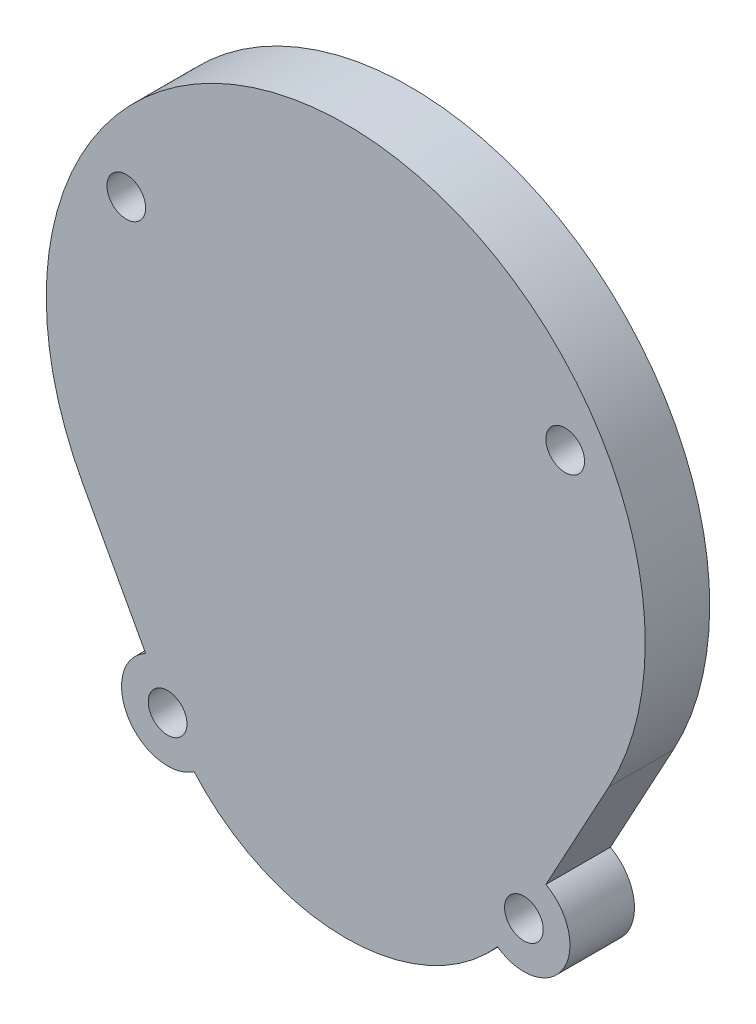
ISO-10303-21;
HEADER;
FILE_DESCRIPTION(('STEP AP214'),'2;1');
FILE_NAME('part.step','',(''),(''),'','','');
FILE_SCHEMA(('AUTOMOTIVE_DESIGN { 1 0 10303 214 1 1 1 1 }'));
ENDSEC;
DATA;
#1=APPLICATION_CONTEXT('core data for automotive mechanical design processes');
#2=APPLICATION_PROTOCOL_DEFINITION('international standard','automotive_design',2000,#1);
#3=PRODUCT_CONTEXT('',#1,'mechanical');
#4=PRODUCT('Part','Part','',(#3));
#5=PRODUCT_RELATED_PRODUCT_CATEGORY('part','',(#4));
#6=PRODUCT_DEFINITION_FORMATION('','',#4);
#7=PRODUCT_DEFINITION_CONTEXT('part definition',#1,'design');
#8=PRODUCT_DEFINITION('design','',#6,#7);
#9=PRODUCT_DEFINITION_SHAPE('','',#8);
#10=(LENGTH_UNIT() NAMED_UNIT(*) SI_UNIT(.MILLI.,.METRE.));
#11=(NAMED_UNIT(*) PLANE_ANGLE_UNIT() SI_UNIT($,.RADIAN.));
#12=(NAMED_UNIT(*) SI_UNIT($,.STERADIAN.) SOLID_ANGLE_UNIT());
#13=UNCERTAINTY_MEASURE_WITH_UNIT(LENGTH_MEASURE(1.E-05),#10,'distance_accuracy_value','');
#14=(GEOMETRIC_REPRESENTATION_CONTEXT(3) GLOBAL_UNCERTAINTY_ASSIGNED_CONTEXT((#13)) GLOBAL_UNIT_ASSIGNED_CONTEXT((#10,
#11,#12)) REPRESENTATION_CONTEXT('',''));
#15=CARTESIAN_POINT('',(0.,0.,0.));
#16=DIRECTION('',(0.,0.,1.));
#17=DIRECTION('',(1.,0.,0.));
#18=AXIS2_PLACEMENT_3D('',#15,#16,#17);
#19=CARTESIAN_POINT('',(19.3326149291812,-32.5,7.));
#20=DIRECTION('',(0.,0.,1.));
#21=DIRECTION('',(1.,0.,0.));
#22=AXIS2_PLACEMENT_3D('',#19,#20,#21);
#23=PLANE('',#22);
#24=CARTESIAN_POINT('',(23.815698604072,13.7500000000001,7.));
#25=DIRECTION('',(0.,0.,1.));
#26=DIRECTION('',(1.,0.,0.));
#27=AXIS2_PLACEMENT_3D('',#24,#25,#26);
#28=CIRCLE('',#27,2.1);
#29=CARTESIAN_POINT('',(25.915698604072,13.7500000000001,7.));
#30=VERTEX_POINT('',#29);
#31=EDGE_CURVE('E264',#30,#30,#28,.T.);
#32=ORIENTED_EDGE('',*,*,#31,.F.);
#33=EDGE_LOOP('',(#32));
#34=FACE_BOUND('',#33,.T.);
#35=CARTESIAN_POINT('',(-19.3326149291812,-32.5,7.));
#36=DIRECTION('',(0.,0.,1.));
#37=DIRECTION('',(1.,0.,0.));
#38=AXIS2_PLACEMENT_3D('',#35,#36,#37);
#39=CIRCLE('',#38,2.1);
#40=CARTESIAN_POINT('',(-17.2326149291812,-32.5,7.));
#41=VERTEX_POINT('',#40);
#42=EDGE_CURVE('E274',#41,#41,#39,.T.);
#43=ORIENTED_EDGE('',*,*,#42,.F.);
#44=EDGE_LOOP('',(#43));
#45=FACE_BOUND('',#44,.T.);
#46=CARTESIAN_POINT('',(19.3326149291812,-32.5,7.));
#47=DIRECTION('',(0.,0.,1.));
#48=DIRECTION('',(1.,0.,0.));
#49=AXIS2_PLACEMENT_3D('',#46,#47,#48);
#50=CIRCLE('',#49,5.);
#51=CARTESIAN_POINT('',(16.4624164398827,-36.5941373489453,7.));
#52=VERTEX_POINT('',#51);
#53=CARTESIAN_POINT('',(21.7189785655448,-28.1062238797315,7.));
#54=VERTEX_POINT('',#53);
#55=EDGE_CURVE('E280',#52,#54,#50,.T.);
#56=ORIENTED_EDGE('',*,*,#55,.T.);
#57=DIRECTION('',(0.477272727272727,0.878755224053691,0.));
#58=VECTOR('',#57,1.);
#59=CARTESIAN_POINT('',(28.559544781745,-15.5113636363636,7.));
#60=LINE('',#59,#58);
#61=CARTESIAN_POINT('',(28.559544781745,-15.5113636363636,7.));
#62=VERTEX_POINT('',#61);
#63=EDGE_CURVE('E283',#54,#62,#60,.T.);
#64=ORIENTED_EDGE('',*,*,#63,.T.);
#65=CARTESIAN_POINT('',(0.,0.,7.));
#66=DIRECTION('',(0.,0.,1.));
#67=DIRECTION('',(1.,0.,0.));
#68=AXIS2_PLACEMENT_3D('',#65,#66,#67);
#69=CIRCLE('',#68,32.5);
#70=CARTESIAN_POINT('',(-28.559544781745,-15.5113636363636,7.));
#71=VERTEX_POINT('',#70);
#72=EDGE_CURVE('E286',#62,#71,#69,.T.);
#73=ORIENTED_EDGE('',*,*,#72,.T.);
#74=DIRECTION('',(0.477272727272728,-0.878755224053691,0.));
#75=VECTOR('',#74,1.);
#76=CARTESIAN_POINT('',(-28.559544781745,-15.5113636363636,7.));
#77=LINE('',#76,#75);
#78=CARTESIAN_POINT('',(-21.7189785655448,-28.1062238797315,7.));
#79=VERTEX_POINT('',#78);
#80=EDGE_CURVE('E288',#71,#79,#77,.T.);
#81=ORIENTED_EDGE('',*,*,#80,.T.);
#82=CARTESIAN_POINT('',(-19.3326149291812,-32.5,7.));
#83=DIRECTION('',(0.,0.,1.));
#84=DIRECTION('',(1.,0.,0.));
#85=AXIS2_PLACEMENT_3D('',#82,#83,#84);
#86=CIRCLE('',#85,5.);
#87=CARTESIAN_POINT('',(-16.4624164398827,-36.5941373489453,7.));
#88=VERTEX_POINT('',#87);
#89=EDGE_CURVE('E290',#79,#88,#86,.T.);
#90=ORIENTED_EDGE('',*,*,#89,.T.);
#91=CARTESIAN_POINT('',(0.,-22.,7.));
#92=DIRECTION('',(0.,0.,1.));
#93=DIRECTION('',(1.,0.,0.));
#94=AXIS2_PLACEMENT_3D('',#91,#92,#93);
#95=CIRCLE('',#94,22.);
#96=EDGE_CURVE('E292',#88,#52,#95,.T.);
#97=ORIENTED_EDGE('',*,*,#96,.T.);
#98=EDGE_LOOP('',(#56,#64,#73,#81,#90,#97));
#99=FACE_BOUND('',#98,.T.);
#100=CARTESIAN_POINT('',(-23.8156986040721,13.7499999999999,7.));
#101=DIRECTION('',(0.,0.,1.));
#102=DIRECTION('',(1.,0.,0.));
#103=AXIS2_PLACEMENT_3D('',#100,#101,#102);
#104=CIRCLE('',#103,2.1);
#105=CARTESIAN_POINT('',(-21.7156986040721,13.7499999999999,7.));
#106=VERTEX_POINT('',#105);
#107=EDGE_CURVE('E269',#106,#106,#104,.T.);
#108=ORIENTED_EDGE('',*,*,#107,.F.);
#109=EDGE_LOOP('',(#108));
#110=FACE_BOUND('',#109,.T.);
#111=CARTESIAN_POINT('',(19.3326149291812,-32.5,7.));
#112=DIRECTION('',(0.,0.,1.));
#113=DIRECTION('',(1.,0.,0.));
#114=AXIS2_PLACEMENT_3D('',#111,#112,#113);
#115=CIRCLE('',#114,2.1);
#116=CARTESIAN_POINT('',(21.4326149291812,-32.5,7.));
#117=VERTEX_POINT('',#116);
#118=EDGE_CURVE('E258',#117,#117,#115,.T.);
#119=ORIENTED_EDGE('',*,*,#118,.F.);
#120=EDGE_LOOP('',(#119));
#121=FACE_BOUND('',#120,.T.);
#122=ADVANCED_FACE('F35',(#34,#45,#99,#110,#121),#23,.T.);
#123=CARTESIAN_POINT('',(19.3326149291812,-32.5,0.));
#124=DIRECTION('',(0.,0.,1.));
#125=DIRECTION('',(1.,0.,0.));
#126=AXIS2_PLACEMENT_3D('',#123,#124,#125);
#127=PLANE('',#126);
#128=CARTESIAN_POINT('',(0.,0.,0.));
#129=DIRECTION('',(0.,0.,-1.));
#130=DIRECTION('',(-1.,0.,0.));
#131=AXIS2_PLACEMENT_3D('',#128,#129,#130);
#132=CIRCLE('',#131,27.);
#133=CARTESIAN_POINT('',(-23.7263910494496,-12.8863636363637,0.));
#134=VERTEX_POINT('',#133);
#135=CARTESIAN_POINT('',(-24.3269653882902,11.7131872262391,0.));
#136=VERTEX_POINT('',#135);
#137=EDGE_CURVE('E58',#134,#136,#132,.T.);
#138=ORIENTED_EDGE('',*,*,#137,.F.);
#139=DIRECTION('',(-0.477272727272728,0.878755224053691,0.));
#140=VECTOR('',#139,1.);
#141=CARTESIAN_POINT('',(-23.7263910494497,-12.8863636363636,0.));
#142=LINE('',#141,#140);
#143=CARTESIAN_POINT('',(-14.4994611968859,-29.875,0.));
#144=VERTEX_POINT('',#143);
#145=EDGE_CURVE('E227',#144,#134,#142,.T.);
#146=ORIENTED_EDGE('',*,*,#145,.F.);
#147=CARTESIAN_POINT('',(0.,-22.,0.));
#148=DIRECTION('',(0.,0.,-1.));
#149=DIRECTION('',(-1.,0.,0.));
#150=AXIS2_PLACEMENT_3D('',#147,#148,#149);
#151=CIRCLE('',#150,16.5);
#152=CARTESIAN_POINT('',(14.4994611968859,-29.875,0.));
#153=VERTEX_POINT('',#152);
#154=EDGE_CURVE('E224',#153,#144,#151,.T.);
#155=ORIENTED_EDGE('',*,*,#154,.F.);
#156=DIRECTION('',(-0.477272727272727,-0.878755224053691,0.));
#157=VECTOR('',#156,1.);
#158=CARTESIAN_POINT('',(23.7263910494497,-12.8863636363636,0.));
#159=LINE('',#158,#157);
#160=CARTESIAN_POINT('',(23.7263910494497,-12.8863636363636,0.));
#161=VERTEX_POINT('',#160);
#162=EDGE_CURVE('E221',#161,#153,#159,.T.);
#163=ORIENTED_EDGE('',*,*,#162,.F.);
#164=CARTESIAN_POINT('',(0.,0.,0.));
#165=DIRECTION('',(0.,0.,-1.));
#166=DIRECTION('',(-1.,0.,0.));
#167=AXIS2_PLACEMENT_3D('',#164,#165,#166);
#168=CIRCLE('',#167,27.);
#169=CARTESIAN_POINT('',(24.3269653882901,11.7131872262393,0.));
#170=VERTEX_POINT('',#169);
#171=EDGE_CURVE('E218',#170,#161,#168,.T.);
#172=ORIENTED_EDGE('',*,*,#171,.F.);
#173=CARTESIAN_POINT('',(23.815698604072,13.7500000000001,0.));
#174=DIRECTION('',(0.,0.,1.));
#175=DIRECTION('',(1.,0.,0.));
#176=AXIS2_PLACEMENT_3D('',#173,#174,#175);
#177=CIRCLE('',#176,2.1);
#178=CARTESIAN_POINT('',(22.3074003913515,15.2111764101246,0.));
#179=VERTEX_POINT('',#178);
#180=EDGE_CURVE('E261',#170,#179,#177,.T.);
#181=ORIENTED_EDGE('',*,*,#180,.T.);
#182=CARTESIAN_POINT('',(0.,0.,0.));
#183=DIRECTION('',(0.,0.,-1.));
#184=DIRECTION('',(-1.,0.,0.));
#185=AXIS2_PLACEMENT_3D('',#182,#183,#184);
#186=CIRCLE('',#185,27.);
#187=CARTESIAN_POINT('',(-22.3074003913516,15.2111764101244,0.));
#188=VERTEX_POINT('',#187);
#189=EDGE_CURVE('E215',#188,#179,#186,.T.);
#190=ORIENTED_EDGE('',*,*,#189,.F.);
#191=CARTESIAN_POINT('',(-23.8156986040721,13.7499999999999,0.));
#192=DIRECTION('',(0.,0.,1.));
#193=DIRECTION('',(1.,0.,0.));
#194=AXIS2_PLACEMENT_3D('',#191,#192,#193);
#195=CIRCLE('',#194,2.1);
#196=EDGE_CURVE('E267',#188,#136,#195,.T.);
#197=ORIENTED_EDGE('',*,*,#196,.T.);
#198=EDGE_LOOP('',(#138,#146,#155,#163,#172,#181,#190,#197));
#199=FACE_BOUND('',#198,.T.);
#200=CARTESIAN_POINT('',(19.3326149291812,-32.5,0.));
#201=DIRECTION('',(0.,0.,1.));
#202=DIRECTION('',(1.,0.,0.));
#203=AXIS2_PLACEMENT_3D('',#200,#201,#202);
#204=CIRCLE('',#203,5.);
#205=CARTESIAN_POINT('',(16.4624164398827,-36.5941373489453,0.));
#206=VERTEX_POINT('',#205);
#207=CARTESIAN_POINT('',(21.7189785655448,-28.1062238797315,0.));
#208=VERTEX_POINT('',#207);
#209=EDGE_CURVE('E277',#206,#208,#204,.T.);
#210=ORIENTED_EDGE('',*,*,#209,.F.);
#211=CARTESIAN_POINT('',(0.,-22.,0.));
#212=DIRECTION('',(0.,0.,1.));
#213=DIRECTION('',(1.,0.,0.));
#214=AXIS2_PLACEMENT_3D('',#211,#212,#213);
#215=CIRCLE('',#214,22.);
#216=CARTESIAN_POINT('',(-16.4624164398827,-36.5941373489453,0.));
#217=VERTEX_POINT('',#216);
#218=EDGE_CURVE('E284',#217,#206,#215,.T.);
#219=ORIENTED_EDGE('',*,*,#218,.F.);
#220=CARTESIAN_POINT('',(-19.3326149291812,-32.5,0.));
#221=DIRECTION('',(0.,0.,1.));
#222=DIRECTION('',(1.,0.,0.));
#223=AXIS2_PLACEMENT_3D('',#220,#221,#222);
#224=CIRCLE('',#223,5.);
#225=CARTESIAN_POINT('',(-21.7189785655448,-28.1062238797315,0.));
#226=VERTEX_POINT('',#225);
#227=EDGE_CURVE('E303',#226,#217,#224,.T.);
#228=ORIENTED_EDGE('',*,*,#227,.F.);
#229=DIRECTION('',(0.477272727272728,-0.878755224053691,0.));
#230=VECTOR('',#229,1.);
#231=CARTESIAN_POINT('',(-28.559544781745,-15.5113636363636,0.));
#232=LINE('',#231,#230);
#233=CARTESIAN_POINT('',(-28.559544781745,-15.5113636363636,0.));
#234=VERTEX_POINT('',#233);
#235=EDGE_CURVE('E301',#234,#226,#232,.T.);
#236=ORIENTED_EDGE('',*,*,#235,.F.);
#237=CARTESIAN_POINT('',(0.,0.,0.));
#238=DIRECTION('',(0.,0.,1.));
#239=DIRECTION('',(1.,0.,0.));
#240=AXIS2_PLACEMENT_3D('',#237,#238,#239);
#241=CIRCLE('',#240,32.5);
#242=CARTESIAN_POINT('',(28.559544781745,-15.5113636363636,0.));
#243=VERTEX_POINT('',#242);
#244=EDGE_CURVE('E299',#243,#234,#241,.T.);
#245=ORIENTED_EDGE('',*,*,#244,.F.);
#246=DIRECTION('',(0.477272727272727,0.878755224053691,0.));
#247=VECTOR('',#246,1.);
#248=CARTESIAN_POINT('',(28.559544781745,-15.5113636363636,0.));
#249=LINE('',#248,#247);
#250=EDGE_CURVE('E297',#208,#243,#249,.T.);
#251=ORIENTED_EDGE('',*,*,#250,.F.);
#252=EDGE_LOOP('',(#210,#219,#228,#236,#245,#251));
#253=FACE_BOUND('',#252,.T.);
#254=CARTESIAN_POINT('',(-19.3326149291812,-32.5,0.));
#255=DIRECTION('',(0.,0.,1.));
#256=DIRECTION('',(1.,0.,0.));
#257=AXIS2_PLACEMENT_3D('',#254,#255,#256);
#258=CIRCLE('',#257,2.1);
#259=CARTESIAN_POINT('',(-17.2326149291812,-32.5,0.));
#260=VERTEX_POINT('',#259);
#261=EDGE_CURVE('E272',#260,#260,#258,.T.);
#262=ORIENTED_EDGE('',*,*,#261,.T.);
#263=EDGE_LOOP('',(#262));
#264=FACE_BOUND('',#263,.T.);
#265=CARTESIAN_POINT('',(19.3326149291812,-32.5,0.));
#266=DIRECTION('',(0.,0.,1.));
#267=DIRECTION('',(1.,0.,0.));
#268=AXIS2_PLACEMENT_3D('',#265,#266,#267);
#269=CIRCLE('',#268,2.1);
#270=CARTESIAN_POINT('',(21.4326149291812,-32.5,0.));
#271=VERTEX_POINT('',#270);
#272=EDGE_CURVE('E253',#271,#271,#269,.T.);
#273=ORIENTED_EDGE('',*,*,#272,.T.);
#274=EDGE_LOOP('',(#273));
#275=FACE_BOUND('',#274,.T.);
#276=ADVANCED_FACE('F327',(#199,#253,#264,#275),#127,.F.);
#277=CARTESIAN_POINT('',(19.3326149291812,-32.5,7.));
#278=DIRECTION('',(0.,0.,-1.));
#279=DIRECTION('',(-1.,0.,0.));
#280=AXIS2_PLACEMENT_3D('',#277,#278,#279);
#281=CYLINDRICAL_SURFACE('',#280,5.);
#282=ORIENTED_EDGE('',*,*,#209,.T.);
#283=DIRECTION('',(0.,0.,-1.));
#284=VECTOR('',#283,1.);
#285=CARTESIAN_POINT('',(21.7189785655448,-28.1062238797315,7.));
#286=LINE('',#285,#284);
#287=EDGE_CURVE('E11',#54,#208,#286,.T.);
#288=ORIENTED_EDGE('',*,*,#287,.F.);
#289=ORIENTED_EDGE('',*,*,#55,.F.);
#290=DIRECTION('',(0.,0.,-1.));
#291=VECTOR('',#290,1.);
#292=CARTESIAN_POINT('',(16.4624164398827,-36.5941373489453,7.));
#293=LINE('',#292,#291);
#294=EDGE_CURVE('E294',#52,#206,#293,.T.);
#295=ORIENTED_EDGE('',*,*,#294,.T.);
#296=EDGE_LOOP('',(#282,#288,#289,#295));
#297=FACE_BOUND('',#296,.T.);
#298=ADVANCED_FACE('F37',(#297),#281,.T.);
#299=CARTESIAN_POINT('',(28.559544781745,-15.5113636363636,7.));
#300=DIRECTION('',(-0.878755224053691,0.477272727272727,0.));
#301=DIRECTION('',(-0.477272727272727,-0.878755224053691,0.));
#302=AXIS2_PLACEMENT_3D('',#299,#300,#301);
#303=PLANE('',#302);
#304=ORIENTED_EDGE('',*,*,#250,.T.);
#305=DIRECTION('',(0.,0.,-1.));
#306=VECTOR('',#305,1.);
#307=CARTESIAN_POINT('',(28.559544781745,-15.5113636363636,7.));
#308=LINE('',#307,#306);
#309=EDGE_CURVE('E43',#62,#243,#308,.T.);
#310=ORIENTED_EDGE('',*,*,#309,.F.);
#311=ORIENTED_EDGE('',*,*,#63,.F.);
#312=ORIENTED_EDGE('',*,*,#287,.T.);
#313=EDGE_LOOP('',(#304,#310,#311,#312));
#314=FACE_BOUND('',#313,.T.);
#315=ADVANCED_FACE('F345',(#314),#303,.F.);
#316=CARTESIAN_POINT('',(0.,0.,7.));
#317=DIRECTION('',(0.,0.,-1.));
#318=DIRECTION('',(-1.,0.,0.));
#319=AXIS2_PLACEMENT_3D('',#316,#317,#318);
#320=CYLINDRICAL_SURFACE('',#319,32.5);
#321=ORIENTED_EDGE('',*,*,#244,.T.);
#322=DIRECTION('',(0.,0.,-1.));
#323=VECTOR('',#322,1.);
#324=CARTESIAN_POINT('',(-28.559544781745,-15.5113636363636,7.));
#325=LINE('',#324,#323);
#326=EDGE_CURVE('E314',#71,#234,#325,.T.);
#327=ORIENTED_EDGE('',*,*,#326,.F.);
#328=ORIENTED_EDGE('',*,*,#72,.F.);
#329=ORIENTED_EDGE('',*,*,#309,.T.);
#330=EDGE_LOOP('',(#321,#327,#328,#329));
#331=FACE_BOUND('',#330,.T.);
#332=ADVANCED_FACE('F321',(#331),#320,.T.);
#333=CARTESIAN_POINT('',(-28.559544781745,-15.5113636363636,7.));
#334=DIRECTION('',(0.878755224053691,0.477272727272728,0.));
#335=DIRECTION('',(-0.477272727272728,0.878755224053691,0.));
#336=AXIS2_PLACEMENT_3D('',#333,#334,#335);
#337=PLANE('',#336);
#338=ORIENTED_EDGE('',*,*,#235,.T.);
#339=DIRECTION('',(0.,0.,-1.));
#340=VECTOR('',#339,1.);
#341=CARTESIAN_POINT('',(-21.7189785655448,-28.1062238797315,7.));
#342=LINE('',#341,#340);
#343=EDGE_CURVE('E311',#79,#226,#342,.T.);
#344=ORIENTED_EDGE('',*,*,#343,.F.);
#345=ORIENTED_EDGE('',*,*,#80,.F.);
#346=ORIENTED_EDGE('',*,*,#326,.T.);
#347=EDGE_LOOP('',(#338,#344,#345,#346));
#348=FACE_BOUND('',#347,.T.);
#349=ADVANCED_FACE('F333',(#348),#337,.F.);
#350=CARTESIAN_POINT('',(-19.3326149291812,-32.5,7.));
#351=DIRECTION('',(0.,0.,-1.));
#352=DIRECTION('',(-1.,0.,0.));
#353=AXIS2_PLACEMENT_3D('',#350,#351,#352);
#354=CYLINDRICAL_SURFACE('',#353,5.);
#355=ORIENTED_EDGE('',*,*,#227,.T.);
#356=DIRECTION('',(0.,0.,-1.));
#357=VECTOR('',#356,1.);
#358=CARTESIAN_POINT('',(-16.4624164398827,-36.5941373489453,7.));
#359=LINE('',#358,#357);
#360=EDGE_CURVE('E308',#88,#217,#359,.T.);
#361=ORIENTED_EDGE('',*,*,#360,.F.);
#362=ORIENTED_EDGE('',*,*,#89,.F.);
#363=ORIENTED_EDGE('',*,*,#343,.T.);
#364=EDGE_LOOP('',(#355,#361,#362,#363));
#365=FACE_BOUND('',#364,.T.);
#366=ADVANCED_FACE('F337',(#365),#354,.T.);
#367=CARTESIAN_POINT('',(0.,-22.,7.));
#368=DIRECTION('',(0.,0.,-1.));
#369=DIRECTION('',(-1.,0.,0.));
#370=AXIS2_PLACEMENT_3D('',#367,#368,#369);
#371=CYLINDRICAL_SURFACE('',#370,22.);
#372=ORIENTED_EDGE('',*,*,#218,.T.);
#373=ORIENTED_EDGE('',*,*,#294,.F.);
#374=ORIENTED_EDGE('',*,*,#96,.F.);
#375=ORIENTED_EDGE('',*,*,#360,.T.);
#376=EDGE_LOOP('',(#372,#373,#374,#375));
#377=FACE_BOUND('',#376,.T.);
#378=ADVANCED_FACE('F348',(#377),#371,.T.);
#379=CARTESIAN_POINT('',(-19.3326149291812,-32.5,7.));
#380=DIRECTION('',(0.,0.,-1.));
#381=DIRECTION('',(-1.,0.,0.));
#382=AXIS2_PLACEMENT_3D('',#379,#380,#381);
#383=CYLINDRICAL_SURFACE('',#382,2.1);
#384=ORIENTED_EDGE('',*,*,#42,.T.);
#385=EDGE_LOOP('',(#384));
#386=FACE_BOUND('',#385,.T.);
#387=ORIENTED_EDGE('',*,*,#261,.F.);
#388=EDGE_LOOP('',(#387));
#389=FACE_BOUND('',#388,.T.);
#390=ADVANCED_FACE('F350',(#386,#389),#383,.F.);
#391=CARTESIAN_POINT('',(-23.8156986040721,13.7499999999999,7.));
#392=DIRECTION('',(0.,0.,-1.));
#393=DIRECTION('',(-1.,0.,0.));
#394=AXIS2_PLACEMENT_3D('',#391,#392,#393);
#395=CYLINDRICAL_SURFACE('',#394,2.1);
#396=ORIENTED_EDGE('',*,*,#107,.T.);
#397=EDGE_LOOP('',(#396));
#398=FACE_BOUND('',#397,.T.);
#399=ORIENTED_EDGE('',*,*,#196,.F.);
#400=DIRECTION('',(0.,0.,1.));
#401=VECTOR('',#400,1.);
#402=CARTESIAN_POINT('',(-22.3074003913516,15.2111764101244,-2.));
#403=LINE('',#402,#401);
#404=CARTESIAN_POINT('',(-22.3074003913516,15.2111764101244,-2.));
#405=VERTEX_POINT('',#404);
#406=EDGE_CURVE('E250',#405,#188,#403,.T.);
#407=ORIENTED_EDGE('',*,*,#406,.F.);
#408=CARTESIAN_POINT('',(-23.8156986040721,13.7499999999999,-2.));
#409=DIRECTION('',(0.,0.,-1.));
#410=DIRECTION('',(-1.,0.,0.));
#411=AXIS2_PLACEMENT_3D('',#408,#409,#410);
#412=CIRCLE('',#411,2.1);
#413=CARTESIAN_POINT('',(-24.3269653882902,11.7131872262391,-2.));
#414=VERTEX_POINT('',#413);
#415=EDGE_CURVE('E187',#414,#405,#412,.F.);
#416=ORIENTED_EDGE('',*,*,#415,.F.);
#417=DIRECTION('',(0.,0.,1.));
#418=VECTOR('',#417,1.);
#419=CARTESIAN_POINT('',(-24.3269653882902,11.7131872262391,-2.));
#420=LINE('',#419,#418);
#421=EDGE_CURVE('E167',#414,#136,#420,.T.);
#422=ORIENTED_EDGE('',*,*,#421,.T.);
#423=EDGE_LOOP('',(#399,#407,#416,#422));
#424=FACE_BOUND('',#423,.T.);
#425=ADVANCED_FACE('F356',(#398,#424),#395,.F.);
#426=CARTESIAN_POINT('',(23.815698604072,13.7500000000001,7.));
#427=DIRECTION('',(0.,0.,-1.));
#428=DIRECTION('',(-1.,0.,0.));
#429=AXIS2_PLACEMENT_3D('',#426,#427,#428);
#430=CYLINDRICAL_SURFACE('',#429,2.1);
#431=ORIENTED_EDGE('',*,*,#31,.T.);
#432=EDGE_LOOP('',(#431));
#433=FACE_BOUND('',#432,.T.);
#434=ORIENTED_EDGE('',*,*,#180,.F.);
#435=DIRECTION('',(0.,0.,1.));
#436=VECTOR('',#435,1.);
#437=CARTESIAN_POINT('',(24.3269653882901,11.7131872262393,-2.));
#438=LINE('',#437,#436);
#439=CARTESIAN_POINT('',(24.3269653882901,11.7131872262393,-2.));
#440=VERTEX_POINT('',#439);
#441=EDGE_CURVE('E244',#440,#170,#438,.T.);
#442=ORIENTED_EDGE('',*,*,#441,.F.);
#443=CARTESIAN_POINT('',(23.815698604072,13.7500000000001,-2.));
#444=DIRECTION('',(0.,0.,-1.));
#445=DIRECTION('',(-1.,0.,0.));
#446=AXIS2_PLACEMENT_3D('',#443,#444,#445);
#447=CIRCLE('',#446,2.1);
#448=CARTESIAN_POINT('',(22.3074003913515,15.2111764101246,-2.));
#449=VERTEX_POINT('',#448);
#450=EDGE_CURVE('E192',#449,#440,#447,.F.);
#451=ORIENTED_EDGE('',*,*,#450,.F.);
#452=DIRECTION('',(0.,0.,1.));
#453=VECTOR('',#452,1.);
#454=CARTESIAN_POINT('',(22.3074003913515,15.2111764101246,-2.));
#455=LINE('',#454,#453);
#456=EDGE_CURVE('E247',#449,#179,#455,.T.);
#457=ORIENTED_EDGE('',*,*,#456,.T.);
#458=EDGE_LOOP('',(#434,#442,#451,#457));
#459=FACE_BOUND('',#458,.T.);
#460=ADVANCED_FACE('F373',(#433,#459),#430,.F.);
#461=CARTESIAN_POINT('',(19.3326149291812,-32.5,7.));
#462=DIRECTION('',(0.,0.,-1.));
#463=DIRECTION('',(-1.,0.,0.));
#464=AXIS2_PLACEMENT_3D('',#461,#462,#463);
#465=CYLINDRICAL_SURFACE('',#464,2.1);
#466=ORIENTED_EDGE('',*,*,#118,.T.);
#467=EDGE_LOOP('',(#466));
#468=FACE_BOUND('',#467,.T.);
#469=ORIENTED_EDGE('',*,*,#272,.F.);
#470=EDGE_LOOP('',(#469));
#471=FACE_BOUND('',#470,.T.);
#472=ADVANCED_FACE('F377',(#468,#471),#465,.F.);
#473=CARTESIAN_POINT('',(0.,0.,-2.));
#474=DIRECTION('',(0.,0.,1.));
#475=DIRECTION('',(1.,0.,0.));
#476=AXIS2_PLACEMENT_3D('',#473,#474,#475);
#477=CYLINDRICAL_SURFACE('',#476,27.);
#478=ORIENTED_EDGE('',*,*,#189,.T.);
#479=ORIENTED_EDGE('',*,*,#456,.F.);
#480=CARTESIAN_POINT('',(0.,0.,-2.));
#481=DIRECTION('',(0.,0.,-1.));
#482=DIRECTION('',(-1.,0.,0.));
#483=AXIS2_PLACEMENT_3D('',#480,#481,#482);
#484=CIRCLE('',#483,27.);
#485=EDGE_CURVE('E190',#405,#449,#484,.T.);
#486=ORIENTED_EDGE('',*,*,#485,.F.);
#487=ORIENTED_EDGE('',*,*,#406,.T.);
#488=EDGE_LOOP('',(#478,#479,#486,#487));
#489=FACE_BOUND('',#488,.T.);
#490=ADVANCED_FACE('F381',(#489),#477,.T.);
#491=CARTESIAN_POINT('',(0.,0.,-2.));
#492=DIRECTION('',(0.,0.,1.));
#493=DIRECTION('',(1.,0.,0.));
#494=AXIS2_PLACEMENT_3D('',#491,#492,#493);
#495=CYLINDRICAL_SURFACE('',#494,27.);
#496=ORIENTED_EDGE('',*,*,#171,.T.);
#497=DIRECTION('',(0.,0.,1.));
#498=VECTOR('',#497,1.);
#499=CARTESIAN_POINT('',(23.7263910494497,-12.8863636363636,-2.));
#500=LINE('',#499,#498);
#501=CARTESIAN_POINT('',(23.7263910494497,-12.8863636363636,-2.));
#502=VERTEX_POINT('',#501);
#503=EDGE_CURVE('E241',#502,#161,#500,.T.);
#504=ORIENTED_EDGE('',*,*,#503,.F.);
#505=CARTESIAN_POINT('',(0.,0.,-2.));
#506=DIRECTION('',(0.,0.,-1.));
#507=DIRECTION('',(-1.,0.,0.));
#508=AXIS2_PLACEMENT_3D('',#505,#506,#507);
#509=CIRCLE('',#508,27.);
#510=EDGE_CURVE('E194',#440,#502,#509,.T.);
#511=ORIENTED_EDGE('',*,*,#510,.F.);
#512=ORIENTED_EDGE('',*,*,#441,.T.);
#513=EDGE_LOOP('',(#496,#504,#511,#512));
#514=FACE_BOUND('',#513,.T.);
#515=ADVANCED_FACE('F399',(#514),#495,.T.);
#516=CARTESIAN_POINT('',(23.7263910494497,-12.8863636363636,-2.));
#517=DIRECTION('',(-0.878755224053691,0.477272727272727,0.));
#518=DIRECTION('',(-0.477272727272727,-0.878755224053691,0.));
#519=AXIS2_PLACEMENT_3D('',#516,#517,#518);
#520=PLANE('',#519);
#521=ORIENTED_EDGE('',*,*,#162,.T.);
#522=DIRECTION('',(0.,0.,1.));
#523=VECTOR('',#522,1.);
#524=CARTESIAN_POINT('',(14.4994611968859,-29.875,-2.));
#525=LINE('',#524,#523);
#526=CARTESIAN_POINT('',(14.4994611968859,-29.875,-2.));
#527=VERTEX_POINT('',#526);
#528=EDGE_CURVE('E238',#527,#153,#525,.T.);
#529=ORIENTED_EDGE('',*,*,#528,.F.);
#530=DIRECTION('',(-0.477272727272727,-0.878755224053691,0.));
#531=VECTOR('',#530,1.);
#532=CARTESIAN_POINT('',(23.7263910494497,-12.8863636363636,-2.));
#533=LINE('',#532,#531);
#534=EDGE_CURVE('E196',#502,#527,#533,.T.);
#535=ORIENTED_EDGE('',*,*,#534,.F.);
#536=ORIENTED_EDGE('',*,*,#503,.T.);
#537=EDGE_LOOP('',(#521,#529,#535,#536));
#538=FACE_BOUND('',#537,.T.);
#539=ADVANCED_FACE('F403',(#538),#520,.F.);
#540=CARTESIAN_POINT('',(0.,-22.,-2.));
#541=DIRECTION('',(0.,0.,1.));
#542=DIRECTION('',(1.,0.,0.));
#543=AXIS2_PLACEMENT_3D('',#540,#541,#542);
#544=CYLINDRICAL_SURFACE('',#543,16.5);
#545=ORIENTED_EDGE('',*,*,#154,.T.);
#546=DIRECTION('',(0.,0.,1.));
#547=VECTOR('',#546,1.);
#548=CARTESIAN_POINT('',(-14.4994611968859,-29.875,-2.));
#549=LINE('',#548,#547);
#550=CARTESIAN_POINT('',(-14.4994611968859,-29.875,-2.));
#551=VERTEX_POINT('',#550);
#552=EDGE_CURVE('E235',#551,#144,#549,.T.);
#553=ORIENTED_EDGE('',*,*,#552,.F.);
#554=CARTESIAN_POINT('',(0.,-22.,-2.));
#555=DIRECTION('',(0.,0.,-1.));
#556=DIRECTION('',(-1.,0.,0.));
#557=AXIS2_PLACEMENT_3D('',#554,#555,#556);
#558=CIRCLE('',#557,16.5);
#559=EDGE_CURVE('E198',#527,#551,#558,.T.);
#560=ORIENTED_EDGE('',*,*,#559,.F.);
#561=ORIENTED_EDGE('',*,*,#528,.T.);
#562=EDGE_LOOP('',(#545,#553,#560,#561));
#563=FACE_BOUND('',#562,.T.);
#564=ADVANCED_FACE('F407',(#563),#544,.T.);
#565=CARTESIAN_POINT('',(-23.7263910494497,-12.8863636363636,-2.));
#566=DIRECTION('',(0.878755224053691,0.477272727272728,0.));
#567=DIRECTION('',(-0.477272727272728,0.878755224053691,0.));
#568=AXIS2_PLACEMENT_3D('',#565,#566,#567);
#569=PLANE('',#568);
#570=ORIENTED_EDGE('',*,*,#145,.T.);
#571=DIRECTION('',(0.,0.,1.));
#572=VECTOR('',#571,1.);
#573=CARTESIAN_POINT('',(-23.7263910494496,-12.8863636363637,-2.));
#574=LINE('',#573,#572);
#575=CARTESIAN_POINT('',(-23.7263910494496,-12.8863636363637,-2.));
#576=VERTEX_POINT('',#575);
#577=EDGE_CURVE('E232',#576,#134,#574,.T.);
#578=ORIENTED_EDGE('',*,*,#577,.F.);
#579=DIRECTION('',(-0.477272727272728,0.878755224053691,0.));
#580=VECTOR('',#579,1.);
#581=CARTESIAN_POINT('',(-23.7263910494497,-12.8863636363636,-2.));
#582=LINE('',#581,#580);
#583=EDGE_CURVE('E200',#551,#576,#582,.T.);
#584=ORIENTED_EDGE('',*,*,#583,.F.);
#585=ORIENTED_EDGE('',*,*,#552,.T.);
#586=EDGE_LOOP('',(#570,#578,#584,#585));
#587=FACE_BOUND('',#586,.T.);
#588=ADVANCED_FACE('F385',(#587),#569,.F.);
#589=CARTESIAN_POINT('',(0.,-22.,-2.));
#590=DIRECTION('',(0.,0.,1.));
#591=DIRECTION('',(1.,0.,0.));
#592=AXIS2_PLACEMENT_3D('',#589,#590,#591);
#593=CYLINDRICAL_SURFACE('',#592,13.5);
#594=CARTESIAN_POINT('',(0.,-22.,0.));
#595=DIRECTION('',(0.,0.,-1.));
#596=DIRECTION('',(-1.,0.,0.));
#597=AXIS2_PLACEMENT_3D('',#594,#595,#596);
#598=CIRCLE('',#597,13.5);
#599=CARTESIAN_POINT('',(11.8631955247248,-28.4431818181818,0.));
#600=VERTEX_POINT('',#599);
#601=CARTESIAN_POINT('',(-11.8631955247248,-28.4431818181818,0.));
#602=VERTEX_POINT('',#601);
#603=EDGE_CURVE('E50',#600,#602,#598,.T.);
#604=ORIENTED_EDGE('',*,*,#603,.F.);
#605=DIRECTION('',(0.,0.,1.));
#606=VECTOR('',#605,1.);
#607=CARTESIAN_POINT('',(11.8631955247248,-28.4431818181818,-2.));
#608=LINE('',#607,#606);
#609=CARTESIAN_POINT('',(11.8631955247248,-28.4431818181818,-2.));
#610=VERTEX_POINT('',#609);
#611=EDGE_CURVE('E158',#610,#600,#608,.T.);
#612=ORIENTED_EDGE('',*,*,#611,.F.);
#613=CARTESIAN_POINT('',(0.,-22.,-2.));
#614=DIRECTION('',(0.,0.,-1.));
#615=DIRECTION('',(-1.,0.,0.));
#616=AXIS2_PLACEMENT_3D('',#613,#614,#615);
#617=CIRCLE('',#616,13.5);
#618=CARTESIAN_POINT('',(-11.8631955247248,-28.4431818181818,-2.));
#619=VERTEX_POINT('',#618);
#620=EDGE_CURVE('E161',#610,#619,#617,.T.);
#621=ORIENTED_EDGE('',*,*,#620,.T.);
#622=DIRECTION('',(0.,0.,1.));
#623=VECTOR('',#622,1.);
#624=CARTESIAN_POINT('',(-11.8631955247248,-28.4431818181818,-2.));
#625=LINE('',#624,#623);
#626=EDGE_CURVE('E204',#619,#602,#625,.T.);
#627=ORIENTED_EDGE('',*,*,#626,.T.);
#628=EDGE_LOOP('',(#604,#612,#621,#627));
#629=FACE_BOUND('',#628,.T.);
#630=ADVANCED_FACE('F160',(#629),#593,.F.);
#631=CARTESIAN_POINT('',(21.0901253772886,-11.4545454545454,-2.));
#632=DIRECTION('',(-0.878755224053691,0.477272727272727,0.));
#633=DIRECTION('',(-0.477272727272727,-0.878755224053691,0.));
#634=AXIS2_PLACEMENT_3D('',#631,#632,#633);
#635=PLANE('',#634);
#636=DIRECTION('',(-0.477272727272727,-0.878755224053691,0.));
#637=VECTOR('',#636,1.);
#638=CARTESIAN_POINT('',(21.0901253772886,-11.4545454545454,0.));
#639=LINE('',#638,#637);
#640=CARTESIAN_POINT('',(21.0901253772886,-11.4545454545454,0.));
#641=VERTEX_POINT('',#640);
#642=EDGE_CURVE('E206',#641,#600,#639,.T.);
#643=ORIENTED_EDGE('',*,*,#642,.F.);
#644=DIRECTION('',(0.,0.,1.));
#645=VECTOR('',#644,1.);
#646=CARTESIAN_POINT('',(21.0901253772886,-11.4545454545454,-2.));
#647=LINE('',#646,#645);
#648=CARTESIAN_POINT('',(21.0901253772886,-11.4545454545454,-2.));
#649=VERTEX_POINT('',#648);
#650=EDGE_CURVE('E168',#649,#641,#647,.T.);
#651=ORIENTED_EDGE('',*,*,#650,.F.);
#652=DIRECTION('',(-0.477272727272727,-0.878755224053691,0.));
#653=VECTOR('',#652,1.);
#654=CARTESIAN_POINT('',(21.0901253772886,-11.4545454545454,-2.));
#655=LINE('',#654,#653);
#656=EDGE_CURVE('E175',#649,#610,#655,.T.);
#657=ORIENTED_EDGE('',*,*,#656,.T.);
#658=ORIENTED_EDGE('',*,*,#611,.T.);
#659=EDGE_LOOP('',(#643,#651,#657,#658));
#660=FACE_BOUND('',#659,.T.);
#661=ADVANCED_FACE('F180',(#660),#635,.T.);
#662=CARTESIAN_POINT('',(0.,0.,-2.));
#663=DIRECTION('',(0.,0.,1.));
#664=DIRECTION('',(1.,0.,0.));
#665=AXIS2_PLACEMENT_3D('',#662,#663,#664);
#666=CYLINDRICAL_SURFACE('',#665,24.);
#667=CARTESIAN_POINT('',(0.,0.,0.));
#668=DIRECTION('',(0.,0.,-1.));
#669=DIRECTION('',(-1.,0.,0.));
#670=AXIS2_PLACEMENT_3D('',#667,#668,#669);
#671=CIRCLE('',#670,24.);
#672=CARTESIAN_POINT('',(-21.0901253772886,-11.4545454545455,0.));
#673=VERTEX_POINT('',#672);
#674=EDGE_CURVE('E209',#673,#641,#671,.T.);
#675=ORIENTED_EDGE('',*,*,#674,.F.);
#676=DIRECTION('',(0.,0.,1.));
#677=VECTOR('',#676,1.);
#678=CARTESIAN_POINT('',(-21.0901253772886,-11.4545454545455,-2.));
#679=LINE('',#678,#677);
#680=CARTESIAN_POINT('',(-21.0901253772886,-11.4545454545455,-2.));
#681=VERTEX_POINT('',#680);
#682=EDGE_CURVE('E255',#681,#673,#679,.T.);
#683=ORIENTED_EDGE('',*,*,#682,.F.);
#684=CARTESIAN_POINT('',(0.,0.,-2.));
#685=DIRECTION('',(0.,0.,-1.));
#686=DIRECTION('',(-1.,0.,0.));
#687=AXIS2_PLACEMENT_3D('',#684,#685,#686);
#688=CIRCLE('',#687,24.);
#689=EDGE_CURVE('E181',#681,#649,#688,.T.);
#690=ORIENTED_EDGE('',*,*,#689,.T.);
#691=ORIENTED_EDGE('',*,*,#650,.T.);
#692=EDGE_LOOP('',(#675,#683,#690,#691));
#693=FACE_BOUND('',#692,.T.);
#694=ADVANCED_FACE('F388',(#693),#666,.F.);
#695=CARTESIAN_POINT('',(-21.0901253772886,-11.4545454545455,-2.));
#696=DIRECTION('',(0.878755224053691,0.477272727272728,0.));
#697=DIRECTION('',(-0.477272727272728,0.878755224053691,0.));
#698=AXIS2_PLACEMENT_3D('',#695,#696,#697);
#699=PLANE('',#698);
#700=DIRECTION('',(-0.477272727272728,0.878755224053691,0.));
#701=VECTOR('',#700,1.);
#702=CARTESIAN_POINT('',(-21.0901253772886,-11.4545454545455,0.));
#703=LINE('',#702,#701);
#704=EDGE_CURVE('E212',#602,#673,#703,.T.);
#705=ORIENTED_EDGE('',*,*,#704,.F.);
#706=ORIENTED_EDGE('',*,*,#626,.F.);
#707=DIRECTION('',(-0.477272727272728,0.878755224053691,0.));
#708=VECTOR('',#707,1.);
#709=CARTESIAN_POINT('',(-21.0901253772886,-11.4545454545455,-2.));
#710=LINE('',#709,#708);
#711=EDGE_CURVE('E178',#619,#681,#710,.T.);
#712=ORIENTED_EDGE('',*,*,#711,.T.);
#713=ORIENTED_EDGE('',*,*,#682,.T.);
#714=EDGE_LOOP('',(#705,#706,#712,#713));
#715=FACE_BOUND('',#714,.T.);
#716=ADVANCED_FACE('F391',(#715),#699,.T.);
#717=CARTESIAN_POINT('',(0.,0.,-2.));
#718=DIRECTION('',(0.,0.,1.));
#719=DIRECTION('',(1.,0.,0.));
#720=AXIS2_PLACEMENT_3D('',#717,#718,#719);
#721=CYLINDRICAL_SURFACE('',#720,27.);
#722=ORIENTED_EDGE('',*,*,#137,.T.);
#723=ORIENTED_EDGE('',*,*,#421,.F.);
#724=CARTESIAN_POINT('',(0.,0.,-2.));
#725=DIRECTION('',(0.,0.,-1.));
#726=DIRECTION('',(-1.,0.,0.));
#727=AXIS2_PLACEMENT_3D('',#724,#725,#726);
#728=CIRCLE('',#727,27.);
#729=EDGE_CURVE('E202',#576,#414,#728,.T.);
#730=ORIENTED_EDGE('',*,*,#729,.F.);
#731=ORIENTED_EDGE('',*,*,#577,.T.);
#732=EDGE_LOOP('',(#722,#723,#730,#731));
#733=FACE_BOUND('',#732,.T.);
#734=ADVANCED_FACE('F395',(#733),#721,.T.);
#735=CARTESIAN_POINT('',(0.,0.,-2.));
#736=DIRECTION('',(0.,0.,-1.));
#737=DIRECTION('',(-1.,0.,0.));
#738=AXIS2_PLACEMENT_3D('',#735,#736,#737);
#739=PLANE('',#738);
#740=ORIENTED_EDGE('',*,*,#620,.F.);
#741=ORIENTED_EDGE('',*,*,#656,.F.);
#742=ORIENTED_EDGE('',*,*,#689,.F.);
#743=ORIENTED_EDGE('',*,*,#711,.F.);
#744=EDGE_LOOP('',(#740,#741,#742,#743));
#745=FACE_BOUND('',#744,.T.);
#746=ORIENTED_EDGE('',*,*,#415,.T.);
#747=ORIENTED_EDGE('',*,*,#485,.T.);
#748=ORIENTED_EDGE('',*,*,#450,.T.);
#749=ORIENTED_EDGE('',*,*,#510,.T.);
#750=ORIENTED_EDGE('',*,*,#534,.T.);
#751=ORIENTED_EDGE('',*,*,#559,.T.);
#752=ORIENTED_EDGE('',*,*,#583,.T.);
#753=ORIENTED_EDGE('',*,*,#729,.T.);
#754=EDGE_LOOP('',(#746,#747,#748,#749,#750,#751,#752,#753));
#755=FACE_BOUND('',#754,.T.);
#756=ADVANCED_FACE('F172',(#745,#755),#739,.T.);
#757=CARTESIAN_POINT('',(0.,0.,0.));
#758=DIRECTION('',(0.,0.,-1.));
#759=DIRECTION('',(-1.,0.,0.));
#760=AXIS2_PLACEMENT_3D('',#757,#758,#759);
#761=CIRCLE('',#760,7.5);
#762=CARTESIAN_POINT('',(-7.5,0.,0.));
#763=VERTEX_POINT('',#762);
#764=EDGE_CURVE('E441',#763,#763,#761,.T.);
#765=ORIENTED_EDGE('',*,*,#764,.F.);
#766=EDGE_LOOP('',(#765));
#767=FACE_BOUND('',#766,.T.);
#768=CARTESIAN_POINT('',(0.,-22.,0.));
#769=DIRECTION('',(0.,0.,-1.));
#770=DIRECTION('',(-1.,0.,0.));
#771=AXIS2_PLACEMENT_3D('',#768,#769,#770);
#772=CIRCLE('',#771,7.05);
#773=CARTESIAN_POINT('',(-7.04999999999998,-22.,0.));
#774=VERTEX_POINT('',#773);
#775=EDGE_CURVE('E440',#774,#774,#772,.T.);
#776=ORIENTED_EDGE('',*,*,#775,.F.);
#777=EDGE_LOOP('',(#776));
#778=FACE_BOUND('',#777,.T.);
#779=ORIENTED_EDGE('',*,*,#642,.T.);
#780=ORIENTED_EDGE('',*,*,#603,.T.);
#781=ORIENTED_EDGE('',*,*,#704,.T.);
#782=ORIENTED_EDGE('',*,*,#674,.T.);
#783=EDGE_LOOP('',(#779,#780,#781,#782));
#784=FACE_BOUND('',#783,.T.);
#785=ADVANCED_FACE('F367',(#767,#778,#784),#127,.F.);
#786=CARTESIAN_POINT('',(0.,-22.,5.));
#787=DIRECTION('',(0.,0.,-1.));
#788=DIRECTION('',(-1.,0.,0.));
#789=AXIS2_PLACEMENT_3D('',#786,#787,#788);
#790=CYLINDRICAL_SURFACE('',#789,7.05);
#791=CARTESIAN_POINT('',(0.,-22.,5.));
#792=DIRECTION('',(0.,0.,-1.));
#793=DIRECTION('',(-1.,0.,0.));
#794=AXIS2_PLACEMENT_3D('',#791,#792,#793);
#795=CIRCLE('',#794,7.05);
#796=CARTESIAN_POINT('',(-7.04999999999998,-22.,5.));
#797=VERTEX_POINT('',#796);
#798=EDGE_CURVE('E207',#797,#797,#795,.T.);
#799=ORIENTED_EDGE('',*,*,#798,.F.);
#800=EDGE_LOOP('',(#799));
#801=FACE_BOUND('',#800,.T.);
#802=ORIENTED_EDGE('',*,*,#775,.T.);
#803=EDGE_LOOP('',(#802));
#804=FACE_BOUND('',#803,.T.);
#805=ADVANCED_FACE('F420',(#801,#804),#790,.F.);
#806=CARTESIAN_POINT('',(0.,-22.,5.));
#807=DIRECTION('',(0.,0.,-1.));
#808=DIRECTION('',(-1.,0.,0.));
#809=AXIS2_PLACEMENT_3D('',#806,#807,#808);
#810=PLANE('',#809);
#811=ORIENTED_EDGE('',*,*,#798,.T.);
#812=EDGE_LOOP('',(#811));
#813=FACE_BOUND('',#812,.T.);
#814=ADVANCED_FACE('F423',(#813),#810,.T.);
#815=CARTESIAN_POINT('',(0.,0.,2.));
#816=DIRECTION('',(0.,0.,-1.));
#817=DIRECTION('',(-1.,0.,0.));
#818=AXIS2_PLACEMENT_3D('',#815,#816,#817);
#819=CYLINDRICAL_SURFACE('',#818,7.5);
#820=CARTESIAN_POINT('',(0.,0.,2.));
#821=DIRECTION('',(0.,0.,-1.));
#822=DIRECTION('',(-1.,0.,0.));
#823=AXIS2_PLACEMENT_3D('',#820,#821,#822);
#824=CIRCLE('',#823,7.5);
#825=CARTESIAN_POINT('',(-7.5,0.,2.));
#826=VERTEX_POINT('',#825);
#827=EDGE_CURVE('E439',#826,#826,#824,.T.);
#828=ORIENTED_EDGE('',*,*,#827,.F.);
#829=EDGE_LOOP('',(#828));
#830=FACE_BOUND('',#829,.T.);
#831=ORIENTED_EDGE('',*,*,#764,.T.);
#832=EDGE_LOOP('',(#831));
#833=FACE_BOUND('',#832,.T.);
#834=ADVANCED_FACE('F427',(#830,#833),#819,.F.);
#835=CARTESIAN_POINT('',(0.,0.,2.));
#836=DIRECTION('',(0.,0.,-1.));
#837=DIRECTION('',(-1.,0.,0.));
#838=AXIS2_PLACEMENT_3D('',#835,#836,#837);
#839=PLANE('',#838);
#840=ORIENTED_EDGE('',*,*,#827,.T.);
#841=EDGE_LOOP('',(#840));
#842=FACE_BOUND('',#841,.T.);
#843=ADVANCED_FACE('F431',(#842),#839,.T.);
#844=CLOSED_SHELL('',(#122,#276,#298,#315,#332,#349,#366,#378,#390,#425,#460,#472,#490,#515,
#539,#564,#588,#630,#661,#694,#716,#734,#756,#785,#805,#814,#834,#843));
#845=MANIFOLD_SOLID_BREP('B2',#844);
#846=ADVANCED_BREP_SHAPE_REPRESENTATION('',(#18,#845),#14);
#847=SHAPE_DEFINITION_REPRESENTATION(#9,#846);
ENDSEC;
END-ISO-10303-21;
